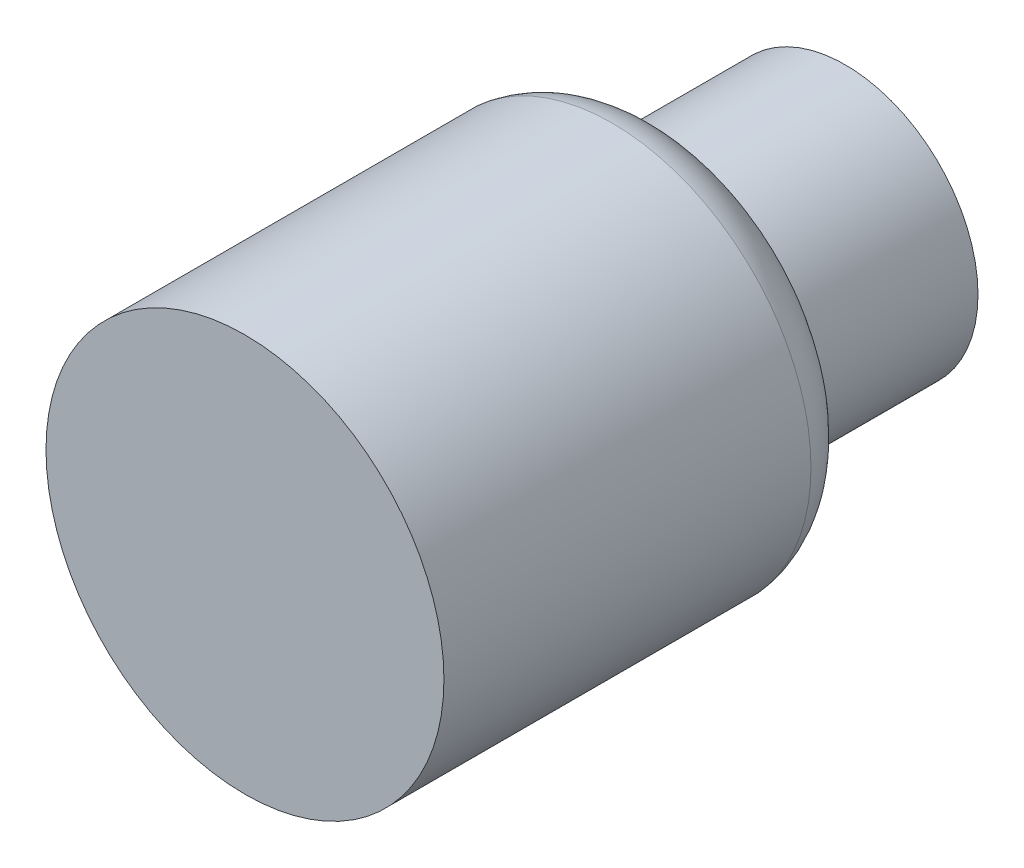
ISO-10303-21;
HEADER;
FILE_DESCRIPTION(('STEP AP214'),'2;1');
FILE_NAME('part.step','',(''),(''),'','','');
FILE_SCHEMA(('AUTOMOTIVE_DESIGN { 1 0 10303 214 1 1 1 1 }'));
ENDSEC;
DATA;
#1=APPLICATION_CONTEXT('core data for automotive mechanical design processes');
#2=APPLICATION_PROTOCOL_DEFINITION('international standard','automotive_design',2000,#1);
#3=PRODUCT_CONTEXT('',#1,'mechanical');
#4=PRODUCT('Part','Part','',(#3));
#5=PRODUCT_RELATED_PRODUCT_CATEGORY('part','',(#4));
#6=PRODUCT_DEFINITION_FORMATION('','',#4);
#7=PRODUCT_DEFINITION_CONTEXT('part definition',#1,'design');
#8=PRODUCT_DEFINITION('design','',#6,#7);
#9=PRODUCT_DEFINITION_SHAPE('','',#8);
#10=(LENGTH_UNIT() NAMED_UNIT(*) SI_UNIT(.MILLI.,.METRE.));
#11=(NAMED_UNIT(*) PLANE_ANGLE_UNIT() SI_UNIT($,.RADIAN.));
#12=(NAMED_UNIT(*) SI_UNIT($,.STERADIAN.) SOLID_ANGLE_UNIT());
#13=UNCERTAINTY_MEASURE_WITH_UNIT(LENGTH_MEASURE(1.E-05),#10,'distance_accuracy_value','');
#14=(GEOMETRIC_REPRESENTATION_CONTEXT(3) GLOBAL_UNCERTAINTY_ASSIGNED_CONTEXT((#13)) GLOBAL_UNIT_ASSIGNED_CONTEXT((#10,
#11,#12)) REPRESENTATION_CONTEXT('',''));
#15=CARTESIAN_POINT('',(0.,0.,0.));
#16=DIRECTION('',(0.,0.,1.));
#17=DIRECTION('',(1.,0.,0.));
#18=AXIS2_PLACEMENT_3D('',#15,#16,#17);
#19=CARTESIAN_POINT('',(21.6124347778327,0.,-29.2905366067996));
#20=DIRECTION('',(0.,0.,1.));
#21=DIRECTION('',(1.,0.,0.));
#22=AXIS2_PLACEMENT_3D('',#19,#20,#21);
#23=PLANE('',#22);
#24=CARTESIAN_POINT('',(0.,0.,-29.2905366067996));
#25=DIRECTION('',(0.,0.,-1.));
#26=DIRECTION('',(-1.,0.,0.));
#27=AXIS2_PLACEMENT_3D('',#24,#25,#26);
#28=CIRCLE('',#27,21.6124347778327);
#29=CARTESIAN_POINT('',(-21.6124347778327,0.,-29.2905366067996));
#30=VERTEX_POINT('',#29);
#31=EDGE_CURVE('E10',#30,#30,#28,.T.);
#32=ORIENTED_EDGE('',*,*,#31,.T.);
#33=EDGE_LOOP('',(#32));
#34=FACE_BOUND('',#33,.T.);
#35=ADVANCED_FACE('F35',(#34),#23,.F.);
#36=CARTESIAN_POINT('',(0.,0.,-39.3384229508797));
#37=DIRECTION('',(0.,0.,-1.));
#38=DIRECTION('',(-1.,0.,0.));
#39=AXIS2_PLACEMENT_3D('',#36,#37,#38);
#40=CYLINDRICAL_SURFACE('',#39,21.6124347778327);
#41=ORIENTED_EDGE('',*,*,#31,.F.);
#42=EDGE_LOOP('',(#41));
#43=FACE_BOUND('',#42,.T.);
#44=CARTESIAN_POINT('',(0.,0.,0.));
#45=DIRECTION('',(0.,0.,-1.));
#46=DIRECTION('',(-1.,0.,0.));
#47=AXIS2_PLACEMENT_3D('',#44,#45,#46);
#48=CIRCLE('',#47,21.6124347778327);
#49=CARTESIAN_POINT('',(-21.6124347778327,0.,0.));
#50=VERTEX_POINT('',#49);
#51=EDGE_CURVE('E41',#50,#50,#48,.T.);
#52=ORIENTED_EDGE('',*,*,#51,.T.);
#53=EDGE_LOOP('',(#52));
#54=FACE_BOUND('',#53,.T.);
#55=ADVANCED_FACE('F67',(#43,#54),#40,.T.);
#56=CARTESIAN_POINT('',(0.,0.,10.1151596886386));
#57=DIRECTION('',(0.,0.,-1.));
#58=DIRECTION('',(-1.,0.,0.));
#59=AXIS2_PLACEMENT_3D('',#56,#57,#58);
#60=TOROIDAL_SURFACE('',#59,22.369869731784,10.1434788527471);
#61=ORIENTED_EDGE('',*,*,#51,.F.);
#62=EDGE_LOOP('',(#61));
#63=FACE_BOUND('',#62,.T.);
#64=CARTESIAN_POINT('',(0.,0.,8.73236006075873));
#65=DIRECTION('',(0.,0.,-1.));
#66=DIRECTION('',(-1.,0.,0.));
#67=AXIS2_PLACEMENT_3D('',#64,#65,#66);
#68=CIRCLE('',#67,32.418652166749);
#69=CARTESIAN_POINT('',(-32.418652166749,0.,8.73236006075873));
#70=VERTEX_POINT('',#69);
#71=EDGE_CURVE('E45',#70,#70,#68,.T.);
#72=ORIENTED_EDGE('',*,*,#71,.T.);
#73=EDGE_LOOP('',(#72));
#74=FACE_BOUND('',#73,.T.);
#75=ADVANCED_FACE('F63',(#63,#74),#60,.T.);
#76=CARTESIAN_POINT('',(0.,0.,-39.3384229508797));
#77=DIRECTION('',(0.,0.,-1.));
#78=DIRECTION('',(-1.,0.,0.));
#79=AXIS2_PLACEMENT_3D('',#76,#77,#78);
#80=CYLINDRICAL_SURFACE('',#79,32.418652166749);
#81=ORIENTED_EDGE('',*,*,#71,.F.);
#82=EDGE_LOOP('',(#81));
#83=FACE_BOUND('',#82,.T.);
#84=CARTESIAN_POINT('',(0.,0.,68.5341679002338));
#85=DIRECTION('',(0.,0.,-1.));
#86=DIRECTION('',(-1.,0.,0.));
#87=AXIS2_PLACEMENT_3D('',#84,#85,#86);
#88=CIRCLE('',#87,32.4186521667491);
#89=CARTESIAN_POINT('',(-32.4186521667491,0.,68.5341679002338));
#90=VERTEX_POINT('',#89);
#91=EDGE_CURVE('E49',#90,#90,#88,.T.);
#92=ORIENTED_EDGE('',*,*,#91,.T.);
#93=EDGE_LOOP('',(#92));
#94=FACE_BOUND('',#93,.T.);
#95=ADVANCED_FACE('F55',(#83,#94),#80,.T.);
#96=CARTESIAN_POINT('',(32.4186521667491,0.,68.5341679002338));
#97=DIRECTION('',(0.,0.,-1.));
#98=DIRECTION('',(-1.,0.,0.));
#99=AXIS2_PLACEMENT_3D('',#96,#97,#98);
#100=PLANE('',#99);
#101=ORIENTED_EDGE('',*,*,#91,.F.);
#102=EDGE_LOOP('',(#101));
#103=FACE_BOUND('',#102,.T.);
#104=ADVANCED_FACE('F57',(#103),#100,.F.);
#105=CLOSED_SHELL('',(#35,#55,#75,#95,#104));
#106=MANIFOLD_SOLID_BREP('B2',#105);
#107=ADVANCED_BREP_SHAPE_REPRESENTATION('',(#18,#106),#14);
#108=SHAPE_DEFINITION_REPRESENTATION(#9,#107);
ENDSEC;
END-ISO-10303-21;
